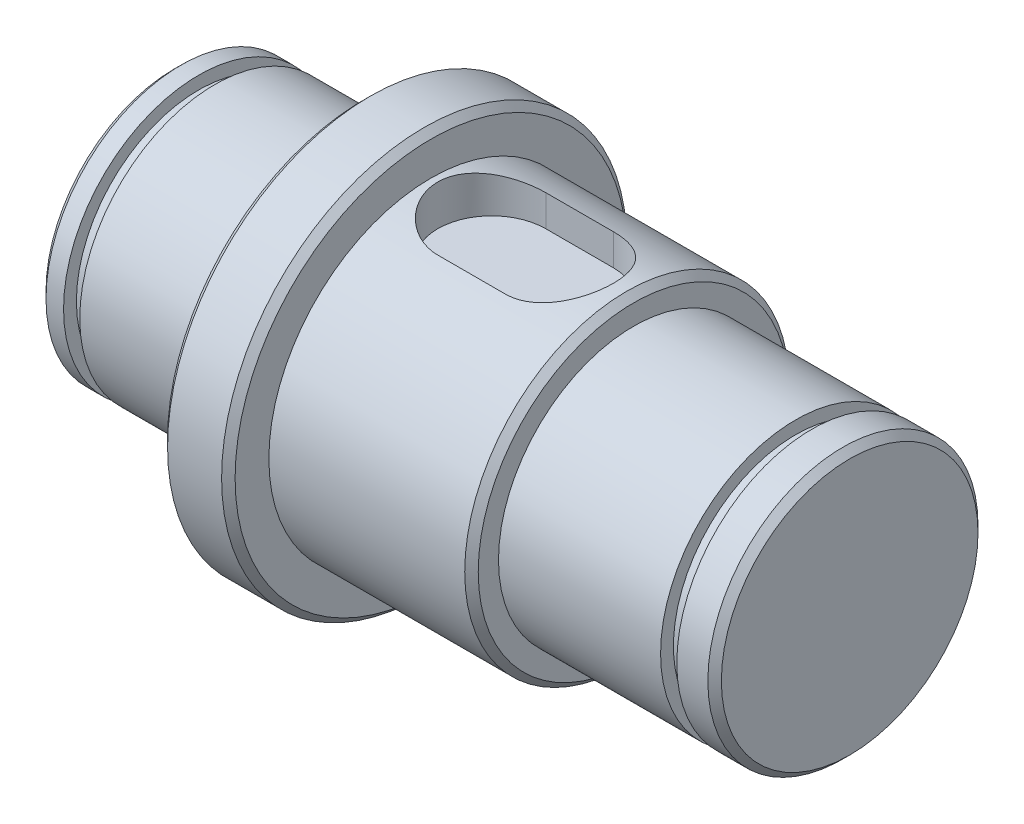
ISO-10303-21;
HEADER;
FILE_DESCRIPTION(('STEP AP214'),'2;1');
FILE_NAME('part.step','',(''),(''),'','','');
FILE_SCHEMA(('AUTOMOTIVE_DESIGN { 1 0 10303 214 1 1 1 1 }'));
ENDSEC;
DATA;
#1=APPLICATION_CONTEXT('core data for automotive mechanical design processes');
#2=APPLICATION_PROTOCOL_DEFINITION('international standard','automotive_design',2000,#1);
#3=PRODUCT_CONTEXT('',#1,'mechanical');
#4=PRODUCT('Part','Part','',(#3));
#5=PRODUCT_RELATED_PRODUCT_CATEGORY('part','',(#4));
#6=PRODUCT_DEFINITION_FORMATION('','',#4);
#7=PRODUCT_DEFINITION_CONTEXT('part definition',#1,'design');
#8=PRODUCT_DEFINITION('design','',#6,#7);
#9=PRODUCT_DEFINITION_SHAPE('','',#8);
#10=(LENGTH_UNIT() NAMED_UNIT(*) SI_UNIT(.MILLI.,.METRE.));
#11=(NAMED_UNIT(*) PLANE_ANGLE_UNIT() SI_UNIT($,.RADIAN.));
#12=(NAMED_UNIT(*) SI_UNIT($,.STERADIAN.) SOLID_ANGLE_UNIT());
#13=UNCERTAINTY_MEASURE_WITH_UNIT(LENGTH_MEASURE(1.E-05),#10,'distance_accuracy_value','');
#14=(GEOMETRIC_REPRESENTATION_CONTEXT(3) GLOBAL_UNCERTAINTY_ASSIGNED_CONTEXT((#13)) GLOBAL_UNIT_ASSIGNED_CONTEXT((#10,
#11,#12)) REPRESENTATION_CONTEXT('',''));
#15=CARTESIAN_POINT('',(0.,0.,0.));
#16=DIRECTION('',(0.,0.,1.));
#17=DIRECTION('',(1.,0.,0.));
#18=AXIS2_PLACEMENT_3D('',#15,#16,#17);
#19=CARTESIAN_POINT('',(-25.,0.,0.));
#20=DIRECTION('',(-1.,0.,0.));
#21=DIRECTION('',(0.,0.,1.));
#22=AXIS2_PLACEMENT_3D('',#19,#20,#21);
#23=CYLINDRICAL_SURFACE('',#22,10.);
#24=CARTESIAN_POINT('',(9.,0.,0.));
#25=DIRECTION('',(-1.,0.,0.));
#26=DIRECTION('',(0.,0.,1.));
#27=AXIS2_PLACEMENT_3D('',#24,#25,#26);
#28=CIRCLE('',#27,10.);
#29=CARTESIAN_POINT('',(9.,0.,10.));
#30=VERTEX_POINT('',#29);
#31=EDGE_CURVE('E127',#30,#30,#28,.T.);
#32=ORIENTED_EDGE('',*,*,#31,.F.);
#33=EDGE_LOOP('',(#32));
#34=FACE_BOUND('',#33,.T.);
#35=CARTESIAN_POINT('',(21.,0.,0.));
#36=DIRECTION('',(1.,0.,0.));
#37=DIRECTION('',(0.,0.,-1.));
#38=AXIS2_PLACEMENT_3D('',#35,#36,#37);
#39=CIRCLE('',#38,10.);
#40=CARTESIAN_POINT('',(21.,0.,-10.));
#41=VERTEX_POINT('',#40);
#42=EDGE_CURVE('E112',#41,#41,#39,.T.);
#43=ORIENTED_EDGE('',*,*,#42,.F.);
#44=EDGE_LOOP('',(#43));
#45=FACE_BOUND('',#44,.T.);
#46=ADVANCED_FACE('F35',(#34,#45),#23,.T.);
#47=CARTESIAN_POINT('',(-25.,0.,0.));
#48=DIRECTION('',(-1.,0.,0.));
#49=DIRECTION('',(0.,0.,1.));
#50=AXIS2_PLACEMENT_3D('',#47,#48,#49);
#51=CYLINDRICAL_SURFACE('',#50,10.);
#52=CARTESIAN_POINT('',(-11.,0.,0.));
#53=DIRECTION('',(-1.,0.,0.));
#54=DIRECTION('',(0.,0.,1.));
#55=AXIS2_PLACEMENT_3D('',#52,#53,#54);
#56=CIRCLE('',#55,10.);
#57=CARTESIAN_POINT('',(-11.,0.,10.));
#58=VERTEX_POINT('',#57);
#59=EDGE_CURVE('E135',#58,#58,#56,.T.);
#60=ORIENTED_EDGE('',*,*,#59,.T.);
#61=EDGE_LOOP('',(#60));
#62=FACE_BOUND('',#61,.T.);
#63=CARTESIAN_POINT('',(-22.,0.,0.));
#64=DIRECTION('',(-1.,0.,0.));
#65=DIRECTION('',(0.,0.,1.));
#66=AXIS2_PLACEMENT_3D('',#63,#64,#65);
#67=CIRCLE('',#66,10.);
#68=CARTESIAN_POINT('',(-22.,0.,10.));
#69=VERTEX_POINT('',#68);
#70=EDGE_CURVE('E124',#69,#69,#67,.T.);
#71=ORIENTED_EDGE('',*,*,#70,.F.);
#72=EDGE_LOOP('',(#71));
#73=FACE_BOUND('',#72,.T.);
#74=ADVANCED_FACE('F219',(#62,#73),#51,.T.);
#75=CARTESIAN_POINT('',(-11.,-10.,0.));
#76=DIRECTION('',(-1.,0.,0.));
#77=DIRECTION('',(0.,0.,1.));
#78=AXIS2_PLACEMENT_3D('',#75,#76,#77);
#79=PLANE('',#78);
#80=CARTESIAN_POINT('',(-11.,0.,0.));
#81=DIRECTION('',(-1.,0.,0.));
#82=DIRECTION('',(0.,0.,1.));
#83=AXIS2_PLACEMENT_3D('',#80,#81,#82);
#84=CIRCLE('',#83,14.5);
#85=CARTESIAN_POINT('',(-11.,0.,14.5));
#86=VERTEX_POINT('',#85);
#87=EDGE_CURVE('E159',#86,#86,#84,.T.);
#88=ORIENTED_EDGE('',*,*,#87,.T.);
#89=EDGE_LOOP('',(#88));
#90=FACE_BOUND('',#89,.T.);
#91=ORIENTED_EDGE('',*,*,#59,.F.);
#92=EDGE_LOOP('',(#91));
#93=FACE_BOUND('',#92,.T.);
#94=ADVANCED_FACE('F215',(#90,#93),#79,.T.);
#95=CARTESIAN_POINT('',(-25.,0.,0.));
#96=DIRECTION('',(-1.,0.,0.));
#97=DIRECTION('',(0.,0.,1.));
#98=AXIS2_PLACEMENT_3D('',#95,#96,#97);
#99=CYLINDRICAL_SURFACE('',#98,15.);
#100=CARTESIAN_POINT('',(-6.5,0.,0.));
#101=DIRECTION('',(1.,0.,0.));
#102=DIRECTION('',(0.,0.,-1.));
#103=AXIS2_PLACEMENT_3D('',#100,#101,#102);
#104=CIRCLE('',#103,15.);
#105=CARTESIAN_POINT('',(-6.5,0.,-15.));
#106=VERTEX_POINT('',#105);
#107=EDGE_CURVE('E153',#106,#106,#104,.F.);
#108=ORIENTED_EDGE('',*,*,#107,.T.);
#109=EDGE_LOOP('',(#108));
#110=FACE_BOUND('',#109,.T.);
#111=CARTESIAN_POINT('',(-10.5,0.,0.));
#112=DIRECTION('',(-1.,0.,0.));
#113=DIRECTION('',(0.,0.,1.));
#114=AXIS2_PLACEMENT_3D('',#111,#112,#113);
#115=CIRCLE('',#114,15.);
#116=CARTESIAN_POINT('',(-10.5,0.,15.));
#117=VERTEX_POINT('',#116);
#118=EDGE_CURVE('E150',#117,#117,#115,.F.);
#119=ORIENTED_EDGE('',*,*,#118,.T.);
#120=EDGE_LOOP('',(#119));
#121=FACE_BOUND('',#120,.T.);
#122=ADVANCED_FACE('F210',(#110,#121),#99,.T.);
#123=CARTESIAN_POINT('',(-6.,-15.,0.));
#124=DIRECTION('',(1.,0.,0.));
#125=DIRECTION('',(0.,0.,-1.));
#126=AXIS2_PLACEMENT_3D('',#123,#124,#125);
#127=PLANE('',#126);
#128=CARTESIAN_POINT('',(-6.,0.,0.));
#129=DIRECTION('',(1.,0.,0.));
#130=DIRECTION('',(0.,0.,-1.));
#131=AXIS2_PLACEMENT_3D('',#128,#129,#130);
#132=CIRCLE('',#131,14.5);
#133=CARTESIAN_POINT('',(-6.,0.,-14.5));
#134=VERTEX_POINT('',#133);
#135=EDGE_CURVE('E156',#134,#134,#132,.T.);
#136=ORIENTED_EDGE('',*,*,#135,.T.);
#137=EDGE_LOOP('',(#136));
#138=FACE_BOUND('',#137,.T.);
#139=CARTESIAN_POINT('',(-6.,0.,0.));
#140=DIRECTION('',(-1.,0.,0.));
#141=DIRECTION('',(0.,0.,1.));
#142=AXIS2_PLACEMENT_3D('',#139,#140,#141);
#143=CIRCLE('',#142,12.);
#144=CARTESIAN_POINT('',(-6.,0.,12.));
#145=VERTEX_POINT('',#144);
#146=EDGE_CURVE('E132',#145,#145,#143,.T.);
#147=ORIENTED_EDGE('',*,*,#146,.T.);
#148=EDGE_LOOP('',(#147));
#149=FACE_BOUND('',#148,.T.);
#150=ADVANCED_FACE('F204',(#138,#149),#127,.T.);
#151=CARTESIAN_POINT('',(-25.,0.,0.));
#152=DIRECTION('',(-1.,0.,0.));
#153=DIRECTION('',(0.,0.,1.));
#154=AXIS2_PLACEMENT_3D('',#151,#152,#153);
#155=CYLINDRICAL_SURFACE('',#154,12.);
#156=CARTESIAN_POINT('',(3.5,11.3137084989848,4.));
#157=CARTESIAN_POINT('',(3.60913132451254,11.3136910923705,4.0000143857665));
#158=CARTESIAN_POINT('',(3.71825291948064,11.3152871024731,3.99553419554536));
#159=CARTESIAN_POINT('',(3.9356496613588,11.3215763859361,3.97769673248752));
#160=CARTESIAN_POINT('',(4.04392502878086,11.3262688232103,3.96434185595522));
#161=CARTESIAN_POINT('',(4.25854478136731,11.3386032840401,3.92891935076474));
#162=CARTESIAN_POINT('',(4.3648939240815,11.3462365576019,3.90687756421021));
#163=CARTESIAN_POINT('',(4.57521322973239,11.364201918496,3.85430689648188));
#164=CARTESIAN_POINT('',(4.67918330654348,11.3745341033652,3.82377770857634));
#165=CARTESIAN_POINT('',(4.9863385275441,11.4091190527027,3.71986482089947));
#166=CARTESIAN_POINT('',(5.18508665195598,11.4369799021453,3.63410266896587));
#167=CARTESIAN_POINT('',(5.56540289833741,11.4991525453998,3.4322845456982));
#168=CARTESIAN_POINT('',(5.74696037723297,11.5334682968154,3.31620997228936));
#169=CARTESIAN_POINT('',(6.09486864556914,11.6061789182336,3.05220793355649));
#170=CARTESIAN_POINT('',(6.26045622848942,11.6446750308563,2.90330055412141));
#171=CARTESIAN_POINT('',(6.56482736511361,11.7205540276094,2.57995313902011));
#172=CARTESIAN_POINT('',(6.70360614588502,11.7579367125094,2.40550856651356));
#173=CARTESIAN_POINT('',(6.9539171590512,11.8285552975691,2.03041476001125));
#174=CARTESIAN_POINT('',(7.06464369326119,11.8616574966305,1.82920040495823));
#175=CARTESIAN_POINT('',(7.25036925102219,11.9187843500282,1.40971695235372));
#176=CARTESIAN_POINT('',(7.32537918861944,11.9428117769099,1.19145308844236));
#177=CARTESIAN_POINT('',(7.43494284516145,11.9783628445804,0.752117395358865));
#178=CARTESIAN_POINT('',(7.47081308509184,11.9902923605184,0.531407346429907));
#179=CARTESIAN_POINT('',(7.5052651992241,12.0017443351774,0.0867958692352795));
#180=CARTESIAN_POINT('',(7.50385595838735,12.0012697502156,-0.137104785886816));
#181=CARTESIAN_POINT('',(7.46462290474738,11.9882415502496,-0.572415361032319));
#182=CARTESIAN_POINT('',(7.42822959866962,11.9761624577266,-0.783970739663759));
#183=CARTESIAN_POINT('',(7.3224270547877,11.9418784019559,-1.19777632834894));
#184=CARTESIAN_POINT('',(7.25301598627315,11.9196728772387,-1.4000260217555));
#185=CARTESIAN_POINT('',(7.08231509392962,11.8670267992102,-1.79261022537109));
#186=CARTESIAN_POINT('',(6.98061796939386,11.8364817702071,-1.98275302130578));
#187=CARTESIAN_POINT('',(6.74855804396861,11.7703352504572,-2.34369935797279));
#188=CARTESIAN_POINT('',(6.61818744541234,11.7347323851811,-2.51449761883744));
#189=CARTESIAN_POINT('',(6.32532420781555,11.6602518814889,-2.84038544309998));
#190=CARTESIAN_POINT('',(6.16160988970107,11.6212989752184,-2.99435951335509));
#191=CARTESIAN_POINT('',(5.81020196665419,11.5458957896576,-3.27310303719343));
#192=CARTESIAN_POINT('',(5.62250064500035,11.5094463215614,-3.39786305574726));
#193=CARTESIAN_POINT('',(5.32528704962278,11.4595759659792,-3.56109757745215));
#194=CARTESIAN_POINT('',(5.22274459523252,11.4436484943195,-3.61182358389815));
#195=CARTESIAN_POINT('',(5.01343501904369,11.4140167075143,-3.70440095621127));
#196=CARTESIAN_POINT('',(4.9066696779244,11.4003114674865,-3.74625601636388));
#197=CARTESIAN_POINT('',(4.68978291343353,11.3755873303494,-3.82067426911565));
#198=CARTESIAN_POINT('',(4.57966528689594,11.3645655126344,-3.85324757051516));
#199=CARTESIAN_POINT('',(4.35683184555263,11.3455648512893,-3.90883841588792));
#200=CARTESIAN_POINT('',(4.24411724203817,11.3375846182867,-3.93186032329112));
#201=CARTESIAN_POINT('',(4.02635755344924,11.3254693235584,-3.96661962949784));
#202=CARTESIAN_POINT('',(3.92145048042139,11.3210705251979,-3.97913375141091));
#203=CARTESIAN_POINT('',(3.71103166730017,11.3151843303776,-3.99582494949883));
#204=CARTESIAN_POINT('',(3.60552088433212,11.3136931771535,-4.00001278362333));
#205=CARTESIAN_POINT('',(3.5,11.3137084989848,-4.));
#206=B_SPLINE_CURVE_WITH_KNOTS('',3,(#156,#157,#158,#159,#160,#161,#162,#163,#164,#165,#166,
#167,#168,#169,#170,#171,#172,#173,#174,#175,#176,#177,#178,#179,#180,#181,#182,#183,#184,#185,
#186,#187,#188,#189,#190,#191,#192,#193,#194,#195,#196,#197,#198,#199,#200,#201,#202,#203,#204,
#205),.UNSPECIFIED.,.F.,.F.,(4,2,2,2,2,2,2,2,2,2,2,2,2,2,2,2,2,2,2,2,2,2,2,2,4),(0.,
0.327273938941731,0.654459544677848,0.980679087086521,1.30691042048862,1.95841627077208,
2.61032287944837,3.28524582541423,3.96028882145702,4.65295094423118,5.34540127175222,
6.01376445600324,6.68196834813282,7.32396236553654,7.96599198323705,8.61646637994584,
9.26711789045787,9.94834778922914,10.6297973968768,10.9759539762202,11.3219661149517,
11.6675999574416,12.0130757272824,12.3299368411189,12.6463882889711),.UNSPECIFIED.);
#207=CARTESIAN_POINT('',(3.5,11.3137084989848,4.));
#208=VERTEX_POINT('',#207);
#209=CARTESIAN_POINT('',(3.5,11.3137084989848,-4.));
#210=VERTEX_POINT('',#209);
#211=EDGE_CURVE('E168',#208,#210,#206,.T.);
#212=ORIENTED_EDGE('',*,*,#211,.F.);
#213=DIRECTION('',(-1.,0.,0.));
#214=VECTOR('',#213,1.);
#215=CARTESIAN_POINT('',(-25.,11.3137084989848,4.));
#216=LINE('',#215,#214);
#217=CARTESIAN_POINT('',(-1.5,11.3137084989848,4.));
#218=VERTEX_POINT('',#217);
#219=EDGE_CURVE('E11',#218,#208,#216,.F.);
#220=ORIENTED_EDGE('',*,*,#219,.F.);
#221=CARTESIAN_POINT('',(-1.5,11.3137084989848,-4.));
#222=CARTESIAN_POINT('',(-1.60913132451253,11.3136910923705,-4.0000143857665));
#223=CARTESIAN_POINT('',(-1.71825291948063,11.3152871024731,-3.99553419554536));
#224=CARTESIAN_POINT('',(-1.9356496613588,11.3215763859361,-3.97769673248752));
#225=CARTESIAN_POINT('',(-2.04392502878085,11.3262688232103,-3.96434185595522));
#226=CARTESIAN_POINT('',(-2.2585447813673,11.3386032840401,-3.92891935076474));
#227=CARTESIAN_POINT('',(-2.36489392408149,11.3462365576019,-3.90687756421021));
#228=CARTESIAN_POINT('',(-2.57521322973238,11.364201918496,-3.85430689648188));
#229=CARTESIAN_POINT('',(-2.67918330654347,11.3745341033652,-3.82377770857634));
#230=CARTESIAN_POINT('',(-2.9863385275441,11.4091190527027,-3.71986482089947));
#231=CARTESIAN_POINT('',(-3.18508665195598,11.4369799021453,-3.63410266896587));
#232=CARTESIAN_POINT('',(-3.5654028983374,11.4991525453998,-3.4322845456982));
#233=CARTESIAN_POINT('',(-3.74696037723296,11.5334682968154,-3.31620997228937));
#234=CARTESIAN_POINT('',(-4.09486864556914,11.6061789182336,-3.05220793355649));
#235=CARTESIAN_POINT('',(-4.26045622848942,11.6446750308563,-2.90330055412141));
#236=CARTESIAN_POINT('',(-4.5648273651136,11.7205540276094,-2.57995313902011));
#237=CARTESIAN_POINT('',(-4.70360614588502,11.7579367125094,-2.40550856651356));
#238=CARTESIAN_POINT('',(-4.95391715905119,11.8285552975691,-2.03041476001125));
#239=CARTESIAN_POINT('',(-5.06464369326119,11.8616574966305,-1.82920040495823));
#240=CARTESIAN_POINT('',(-5.25036925102218,11.9187843500282,-1.40971695235373));
#241=CARTESIAN_POINT('',(-5.32537918861944,11.9428117769099,-1.19145308844236));
#242=CARTESIAN_POINT('',(-5.43494284516144,11.9783628445804,-0.752117395358866));
#243=CARTESIAN_POINT('',(-5.47081308509184,11.9902923605184,-0.531407346429907));
#244=CARTESIAN_POINT('',(-5.50526519922409,12.0017443351774,-0.08679586923528));
#245=CARTESIAN_POINT('',(-5.50385595838734,12.0012697502156,0.137104785886816));
#246=CARTESIAN_POINT('',(-5.46462290474737,11.9882415502496,0.572415361032319));
#247=CARTESIAN_POINT('',(-5.42822959866961,11.9761624577266,0.783970739663758));
#248=CARTESIAN_POINT('',(-5.3224270547877,11.9418784019559,1.19777632834894));
#249=CARTESIAN_POINT('',(-5.25301598627314,11.9196728772387,1.4000260217555));
#250=CARTESIAN_POINT('',(-5.08231509392962,11.8670267992102,1.79261022537109));
#251=CARTESIAN_POINT('',(-4.98061796939386,11.8364817702071,1.98275302130578));
#252=CARTESIAN_POINT('',(-4.7485580439686,11.7703352504572,2.34369935797278));
#253=CARTESIAN_POINT('',(-4.61818744541233,11.7347323851811,2.51449761883744));
#254=CARTESIAN_POINT('',(-4.32532420781555,11.6602518814889,2.84038544309998));
#255=CARTESIAN_POINT('',(-4.16160988970107,11.6212989752184,2.99435951335509));
#256=CARTESIAN_POINT('',(-3.81020196665418,11.5458957896576,3.27310303719343));
#257=CARTESIAN_POINT('',(-3.62250064500035,11.5094463215614,3.39786305574725));
#258=CARTESIAN_POINT('',(-3.32528704962278,11.4595759659792,3.56109757745215));
#259=CARTESIAN_POINT('',(-3.22274459523252,11.4436484943195,3.61182358389815));
#260=CARTESIAN_POINT('',(-3.01343501904369,11.4140167075143,3.70440095621127));
#261=CARTESIAN_POINT('',(-2.9066696779244,11.4003114674865,3.74625601636388));
#262=CARTESIAN_POINT('',(-2.68978291343353,11.3755873303494,3.82067426911565));
#263=CARTESIAN_POINT('',(-2.57966528689594,11.3645655126344,3.85324757051516));
#264=CARTESIAN_POINT('',(-2.35683184555263,11.3455648512893,3.90883841588792));
#265=CARTESIAN_POINT('',(-2.24411724203817,11.3375846182867,3.93186032329112));
#266=CARTESIAN_POINT('',(-2.02635755344924,11.3254693235584,3.96661962949784));
#267=CARTESIAN_POINT('',(-1.92145048042139,11.3210705251979,3.97913375141091));
#268=CARTESIAN_POINT('',(-1.71103166730016,11.3151843303776,3.99582494949883));
#269=CARTESIAN_POINT('',(-1.60552088433212,11.3136931771535,4.00001278362333));
#270=CARTESIAN_POINT('',(-1.5,11.3137084989848,4.));
#271=B_SPLINE_CURVE_WITH_KNOTS('',3,(#221,#222,#223,#224,#225,#226,#227,#228,#229,#230,#231,
#232,#233,#234,#235,#236,#237,#238,#239,#240,#241,#242,#243,#244,#245,#246,#247,#248,#249,#250,
#251,#252,#253,#254,#255,#256,#257,#258,#259,#260,#261,#262,#263,#264,#265,#266,#267,#268,#269,
#270),.UNSPECIFIED.,.F.,.F.,(4,2,2,2,2,2,2,2,2,2,2,2,2,2,2,2,2,2,2,2,2,2,2,2,4),(0.,
0.32727393894173,0.654459544677847,0.980679087086519,1.30691042048862,1.95841627077208,
2.61032287944837,3.28524582541423,3.96028882145702,4.65295094423118,5.34540127175222,
6.01376445600324,6.68196834813282,7.32396236553654,7.96599198323704,8.61646637994584,
9.26711789045787,9.94834778922914,10.6297973968768,10.9759539762202,11.3219661149517,
11.6675999574416,12.0130757272824,12.3299368411189,12.6463882889711),.UNSPECIFIED.);
#272=CARTESIAN_POINT('',(-1.5,11.3137084989848,-4.));
#273=VERTEX_POINT('',#272);
#274=EDGE_CURVE('E44',#273,#218,#271,.T.);
#275=ORIENTED_EDGE('',*,*,#274,.F.);
#276=DIRECTION('',(-1.,0.,0.));
#277=VECTOR('',#276,1.);
#278=CARTESIAN_POINT('',(-25.,11.3137084989848,-4.));
#279=LINE('',#278,#277);
#280=EDGE_CURVE('E176',#210,#273,#279,.T.);
#281=ORIENTED_EDGE('',*,*,#280,.F.);
#282=EDGE_LOOP('',(#212,#220,#275,#281));
#283=FACE_BOUND('',#282,.T.);
#284=CARTESIAN_POINT('',(8.49999999999999,0.,0.));
#285=DIRECTION('',(1.,0.,0.));
#286=DIRECTION('',(0.,0.,-1.));
#287=AXIS2_PLACEMENT_3D('',#284,#285,#286);
#288=CIRCLE('',#287,12.);
#289=CARTESIAN_POINT('',(8.49999999999999,0.,-12.));
#290=VERTEX_POINT('',#289);
#291=EDGE_CURVE('E144',#290,#290,#288,.F.);
#292=ORIENTED_EDGE('',*,*,#291,.T.);
#293=EDGE_LOOP('',(#292));
#294=FACE_BOUND('',#293,.T.);
#295=ORIENTED_EDGE('',*,*,#146,.F.);
#296=EDGE_LOOP('',(#295));
#297=FACE_BOUND('',#296,.T.);
#298=ADVANCED_FACE('F177',(#283,#294,#297),#155,.T.);
#299=CARTESIAN_POINT('',(9.,-12.,0.));
#300=DIRECTION('',(1.,0.,0.));
#301=DIRECTION('',(0.,0.,-1.));
#302=AXIS2_PLACEMENT_3D('',#299,#300,#301);
#303=PLANE('',#302);
#304=CARTESIAN_POINT('',(9.,0.,0.));
#305=DIRECTION('',(1.,0.,0.));
#306=DIRECTION('',(0.,0.,-1.));
#307=AXIS2_PLACEMENT_3D('',#304,#305,#306);
#308=CIRCLE('',#307,11.5);
#309=CARTESIAN_POINT('',(9.,0.,-11.5));
#310=VERTEX_POINT('',#309);
#311=EDGE_CURVE('E147',#310,#310,#308,.T.);
#312=ORIENTED_EDGE('',*,*,#311,.T.);
#313=EDGE_LOOP('',(#312));
#314=FACE_BOUND('',#313,.T.);
#315=ORIENTED_EDGE('',*,*,#31,.T.);
#316=EDGE_LOOP('',(#315));
#317=FACE_BOUND('',#316,.T.);
#318=ADVANCED_FACE('F203',(#314,#317),#303,.T.);
#319=CARTESIAN_POINT('',(-22.,0.,0.));
#320=DIRECTION('',(-1.,0.,0.));
#321=DIRECTION('',(0.,0.,1.));
#322=AXIS2_PLACEMENT_3D('',#319,#320,#321);
#323=PLANE('',#322);
#324=CARTESIAN_POINT('',(-22.,0.,0.));
#325=DIRECTION('',(-1.,0.,0.));
#326=DIRECTION('',(0.,0.,1.));
#327=AXIS2_PLACEMENT_3D('',#324,#325,#326);
#328=CIRCLE('',#327,9.05);
#329=CARTESIAN_POINT('',(-22.,0.,9.05));
#330=VERTEX_POINT('',#329);
#331=EDGE_CURVE('E118',#330,#330,#328,.T.);
#332=ORIENTED_EDGE('',*,*,#331,.F.);
#333=EDGE_LOOP('',(#332));
#334=FACE_BOUND('',#333,.T.);
#335=ORIENTED_EDGE('',*,*,#70,.T.);
#336=EDGE_LOOP('',(#335));
#337=FACE_BOUND('',#336,.T.);
#338=ADVANCED_FACE('F266',(#334,#337),#323,.T.);
#339=CARTESIAN_POINT('',(-23.2,0.,0.));
#340=DIRECTION('',(-1.,0.,0.));
#341=DIRECTION('',(0.,0.,1.));
#342=AXIS2_PLACEMENT_3D('',#339,#340,#341);
#343=PLANE('',#342);
#344=CARTESIAN_POINT('',(-23.2,0.,0.));
#345=DIRECTION('',(-1.,0.,0.));
#346=DIRECTION('',(0.,0.,1.));
#347=AXIS2_PLACEMENT_3D('',#344,#345,#346);
#348=CIRCLE('',#347,9.05);
#349=CARTESIAN_POINT('',(-23.2,0.,9.05));
#350=VERTEX_POINT('',#349);
#351=EDGE_CURVE('E115',#350,#350,#348,.T.);
#352=ORIENTED_EDGE('',*,*,#351,.T.);
#353=EDGE_LOOP('',(#352));
#354=FACE_BOUND('',#353,.T.);
#355=CARTESIAN_POINT('',(-23.2,0.,0.));
#356=DIRECTION('',(-1.,0.,0.));
#357=DIRECTION('',(0.,0.,1.));
#358=AXIS2_PLACEMENT_3D('',#355,#356,#357);
#359=CIRCLE('',#358,10.);
#360=CARTESIAN_POINT('',(-23.2,0.,10.));
#361=VERTEX_POINT('',#360);
#362=EDGE_CURVE('E121',#361,#361,#359,.T.);
#363=ORIENTED_EDGE('',*,*,#362,.F.);
#364=EDGE_LOOP('',(#363));
#365=FACE_BOUND('',#364,.T.);
#366=ADVANCED_FACE('F264',(#354,#365),#343,.F.);
#367=CARTESIAN_POINT('',(-22.,0.,0.));
#368=DIRECTION('',(-1.,0.,0.));
#369=DIRECTION('',(0.,0.,1.));
#370=AXIS2_PLACEMENT_3D('',#367,#368,#369);
#371=CYLINDRICAL_SURFACE('',#370,9.05);
#372=ORIENTED_EDGE('',*,*,#331,.T.);
#373=EDGE_LOOP('',(#372));
#374=FACE_BOUND('',#373,.T.);
#375=ORIENTED_EDGE('',*,*,#351,.F.);
#376=EDGE_LOOP('',(#375));
#377=FACE_BOUND('',#376,.T.);
#378=ADVANCED_FACE('F260',(#374,#377),#371,.T.);
#379=CARTESIAN_POINT('',(-25.,0.,0.));
#380=DIRECTION('',(-1.,0.,0.));
#381=DIRECTION('',(0.,0.,1.));
#382=AXIS2_PLACEMENT_3D('',#379,#380,#381);
#383=PLANE('',#382);
#384=CARTESIAN_POINT('',(-25.,0.,0.));
#385=DIRECTION('',(-1.,0.,0.));
#386=DIRECTION('',(0.,0.,1.));
#387=AXIS2_PLACEMENT_3D('',#384,#385,#386);
#388=CIRCLE('',#387,9.50000000000002);
#389=CARTESIAN_POINT('',(-25.,0.,9.50000000000002));
#390=VERTEX_POINT('',#389);
#391=EDGE_CURVE('E162',#390,#390,#388,.T.);
#392=ORIENTED_EDGE('',*,*,#391,.T.);
#393=EDGE_LOOP('',(#392));
#394=FACE_BOUND('',#393,.T.);
#395=ADVANCED_FACE('F263',(#394),#383,.T.);
#396=CARTESIAN_POINT('',(-24.5,0.,0.));
#397=DIRECTION('',(-1.,0.,0.));
#398=DIRECTION('',(0.,0.,1.));
#399=AXIS2_PLACEMENT_3D('',#396,#397,#398);
#400=CIRCLE('',#399,10.);
#401=CARTESIAN_POINT('',(-24.5,0.,10.));
#402=VERTEX_POINT('',#401);
#403=EDGE_CURVE('E165',#402,#402,#400,.F.);
#404=ORIENTED_EDGE('',*,*,#403,.T.);
#405=EDGE_LOOP('',(#404));
#406=FACE_BOUND('',#405,.T.);
#407=ORIENTED_EDGE('',*,*,#362,.T.);
#408=EDGE_LOOP('',(#407));
#409=FACE_BOUND('',#408,.T.);
#410=ADVANCED_FACE('F228',(#406,#409),#51,.T.);
#411=CARTESIAN_POINT('',(21.,0.,0.));
#412=DIRECTION('',(1.,0.,0.));
#413=DIRECTION('',(0.,0.,-1.));
#414=AXIS2_PLACEMENT_3D('',#411,#412,#413);
#415=PLANE('',#414);
#416=CARTESIAN_POINT('',(21.,0.,0.));
#417=DIRECTION('',(1.,0.,0.));
#418=DIRECTION('',(0.,0.,-1.));
#419=AXIS2_PLACEMENT_3D('',#416,#417,#418);
#420=CIRCLE('',#419,9.05);
#421=CARTESIAN_POINT('',(21.,0.,-9.05));
#422=VERTEX_POINT('',#421);
#423=EDGE_CURVE('E106',#422,#422,#420,.T.);
#424=ORIENTED_EDGE('',*,*,#423,.F.);
#425=EDGE_LOOP('',(#424));
#426=FACE_BOUND('',#425,.T.);
#427=ORIENTED_EDGE('',*,*,#42,.T.);
#428=EDGE_LOOP('',(#427));
#429=FACE_BOUND('',#428,.T.);
#430=ADVANCED_FACE('F250',(#426,#429),#415,.T.);
#431=CARTESIAN_POINT('',(22.2,0.,0.));
#432=DIRECTION('',(1.,0.,0.));
#433=DIRECTION('',(0.,0.,-1.));
#434=AXIS2_PLACEMENT_3D('',#431,#432,#433);
#435=PLANE('',#434);
#436=CARTESIAN_POINT('',(22.2,0.,0.));
#437=DIRECTION('',(1.,0.,0.));
#438=DIRECTION('',(0.,0.,-1.));
#439=AXIS2_PLACEMENT_3D('',#436,#437,#438);
#440=CIRCLE('',#439,9.05);
#441=CARTESIAN_POINT('',(22.2,0.,-9.05));
#442=VERTEX_POINT('',#441);
#443=EDGE_CURVE('E101',#442,#442,#440,.T.);
#444=ORIENTED_EDGE('',*,*,#443,.T.);
#445=EDGE_LOOP('',(#444));
#446=FACE_BOUND('',#445,.T.);
#447=CARTESIAN_POINT('',(22.2,0.,0.));
#448=DIRECTION('',(1.,0.,0.));
#449=DIRECTION('',(0.,0.,-1.));
#450=AXIS2_PLACEMENT_3D('',#447,#448,#449);
#451=CIRCLE('',#450,10.);
#452=CARTESIAN_POINT('',(22.2,0.,-10.));
#453=VERTEX_POINT('',#452);
#454=EDGE_CURVE('E109',#453,#453,#451,.T.);
#455=ORIENTED_EDGE('',*,*,#454,.F.);
#456=EDGE_LOOP('',(#455));
#457=FACE_BOUND('',#456,.T.);
#458=ADVANCED_FACE('F248',(#446,#457),#435,.F.);
#459=CARTESIAN_POINT('',(21.,0.,0.));
#460=DIRECTION('',(1.,0.,0.));
#461=DIRECTION('',(0.,0.,-1.));
#462=AXIS2_PLACEMENT_3D('',#459,#460,#461);
#463=CYLINDRICAL_SURFACE('',#462,9.05);
#464=ORIENTED_EDGE('',*,*,#423,.T.);
#465=EDGE_LOOP('',(#464));
#466=FACE_BOUND('',#465,.T.);
#467=ORIENTED_EDGE('',*,*,#443,.F.);
#468=EDGE_LOOP('',(#467));
#469=FACE_BOUND('',#468,.T.);
#470=ADVANCED_FACE('F194',(#466,#469),#463,.T.);
#471=CARTESIAN_POINT('',(25.,-10.,0.));
#472=DIRECTION('',(1.,0.,0.));
#473=DIRECTION('',(0.,0.,-1.));
#474=AXIS2_PLACEMENT_3D('',#471,#472,#473);
#475=PLANE('',#474);
#476=CARTESIAN_POINT('',(25.,0.,0.));
#477=DIRECTION('',(1.,0.,0.));
#478=DIRECTION('',(0.,0.,-1.));
#479=AXIS2_PLACEMENT_3D('',#476,#477,#478);
#480=CIRCLE('',#479,9.49999999999999);
#481=CARTESIAN_POINT('',(25.,0.,-9.49999999999999));
#482=VERTEX_POINT('',#481);
#483=EDGE_CURVE('E141',#482,#482,#480,.T.);
#484=ORIENTED_EDGE('',*,*,#483,.T.);
#485=EDGE_LOOP('',(#484));
#486=FACE_BOUND('',#485,.T.);
#487=ADVANCED_FACE('F234',(#486),#475,.T.);
#488=CARTESIAN_POINT('',(24.5,0.,0.));
#489=DIRECTION('',(1.,0.,0.));
#490=DIRECTION('',(0.,0.,-1.));
#491=AXIS2_PLACEMENT_3D('',#488,#489,#490);
#492=CIRCLE('',#491,10.);
#493=CARTESIAN_POINT('',(24.5,0.,-10.));
#494=VERTEX_POINT('',#493);
#495=EDGE_CURVE('E138',#494,#494,#492,.F.);
#496=ORIENTED_EDGE('',*,*,#495,.T.);
#497=EDGE_LOOP('',(#496));
#498=FACE_BOUND('',#497,.T.);
#499=ORIENTED_EDGE('',*,*,#454,.T.);
#500=EDGE_LOOP('',(#499));
#501=FACE_BOUND('',#500,.T.);
#502=ADVANCED_FACE('F222',(#498,#501),#23,.T.);
#503=CARTESIAN_POINT('',(24.5,0.,0.));
#504=DIRECTION('',(-1.,0.,0.));
#505=DIRECTION('',(0.,0.,1.));
#506=AXIS2_PLACEMENT_3D('',#503,#504,#505);
#507=CONICAL_SURFACE('',#506,10.,0.785398163397448);
#508=ORIENTED_EDGE('',*,*,#483,.F.);
#509=EDGE_LOOP('',(#508));
#510=FACE_BOUND('',#509,.T.);
#511=ORIENTED_EDGE('',*,*,#495,.F.);
#512=EDGE_LOOP('',(#511));
#513=FACE_BOUND('',#512,.T.);
#514=ADVANCED_FACE('F233',(#510,#513),#507,.T.);
#515=CARTESIAN_POINT('',(8.49999999999999,0.,0.));
#516=DIRECTION('',(-1.,0.,0.));
#517=DIRECTION('',(0.,0.,1.));
#518=AXIS2_PLACEMENT_3D('',#515,#516,#517);
#519=CONICAL_SURFACE('',#518,12.,0.785398163397448);
#520=ORIENTED_EDGE('',*,*,#311,.F.);
#521=EDGE_LOOP('',(#520));
#522=FACE_BOUND('',#521,.T.);
#523=ORIENTED_EDGE('',*,*,#291,.F.);
#524=EDGE_LOOP('',(#523));
#525=FACE_BOUND('',#524,.T.);
#526=ADVANCED_FACE('F240',(#522,#525),#519,.T.);
#527=CARTESIAN_POINT('',(-6.5,0.,0.));
#528=DIRECTION('',(-1.,0.,0.));
#529=DIRECTION('',(0.,0.,1.));
#530=AXIS2_PLACEMENT_3D('',#527,#528,#529);
#531=CONICAL_SURFACE('',#530,15.,0.785398163397452);
#532=ORIENTED_EDGE('',*,*,#135,.F.);
#533=EDGE_LOOP('',(#532));
#534=FACE_BOUND('',#533,.T.);
#535=ORIENTED_EDGE('',*,*,#107,.F.);
#536=EDGE_LOOP('',(#535));
#537=FACE_BOUND('',#536,.T.);
#538=ADVANCED_FACE('F296',(#534,#537),#531,.T.);
#539=CARTESIAN_POINT('',(-11.,0.,0.));
#540=DIRECTION('',(1.,0.,0.));
#541=DIRECTION('',(0.,0.,-1.));
#542=AXIS2_PLACEMENT_3D('',#539,#540,#541);
#543=CONICAL_SURFACE('',#542,14.5,0.785398163397443);
#544=ORIENTED_EDGE('',*,*,#118,.F.);
#545=EDGE_LOOP('',(#544));
#546=FACE_BOUND('',#545,.T.);
#547=ORIENTED_EDGE('',*,*,#87,.F.);
#548=EDGE_LOOP('',(#547));
#549=FACE_BOUND('',#548,.T.);
#550=ADVANCED_FACE('F302',(#546,#549),#543,.T.);
#551=CARTESIAN_POINT('',(-25.,0.,0.));
#552=DIRECTION('',(1.,0.,0.));
#553=DIRECTION('',(0.,0.,-1.));
#554=AXIS2_PLACEMENT_3D('',#551,#552,#553);
#555=CONICAL_SURFACE('',#554,9.50000000000002,0.785398163397441);
#556=ORIENTED_EDGE('',*,*,#403,.F.);
#557=EDGE_LOOP('',(#556));
#558=FACE_BOUND('',#557,.T.);
#559=ORIENTED_EDGE('',*,*,#391,.F.);
#560=EDGE_LOOP('',(#559));
#561=FACE_BOUND('',#560,.T.);
#562=ADVANCED_FACE('F38',(#558,#561),#555,.T.);
#563=CARTESIAN_POINT('',(-1.5,9.00000000000001,0.));
#564=DIRECTION('',(0.,1.,0.));
#565=DIRECTION('',(0.,0.,1.));
#566=AXIS2_PLACEMENT_3D('',#563,#564,#565);
#567=CYLINDRICAL_SURFACE('',#566,4.);
#568=DIRECTION('',(0.,1.,0.));
#569=VECTOR('',#568,1.);
#570=CARTESIAN_POINT('',(-1.5,9.00000000000001,-4.));
#571=LINE('',#570,#569);
#572=CARTESIAN_POINT('',(-1.5,9.00000000000001,-4.));
#573=VERTEX_POINT('',#572);
#574=EDGE_CURVE('E99',#573,#273,#571,.T.);
#575=ORIENTED_EDGE('',*,*,#574,.T.);
#576=ORIENTED_EDGE('',*,*,#274,.T.);
#577=DIRECTION('',(0.,1.,0.));
#578=VECTOR('',#577,1.);
#579=CARTESIAN_POINT('',(-1.5,9.00000000000001,4.));
#580=LINE('',#579,#578);
#581=CARTESIAN_POINT('',(-1.5,9.00000000000001,4.));
#582=VERTEX_POINT('',#581);
#583=EDGE_CURVE('E50',#582,#218,#580,.T.);
#584=ORIENTED_EDGE('',*,*,#583,.F.);
#585=CARTESIAN_POINT('',(-1.5,9.00000000000001,0.));
#586=DIRECTION('',(0.,1.,0.));
#587=DIRECTION('',(0.,0.,1.));
#588=AXIS2_PLACEMENT_3D('',#585,#586,#587);
#589=CIRCLE('',#588,4.);
#590=EDGE_CURVE('E79',#573,#582,#589,.T.);
#591=ORIENTED_EDGE('',*,*,#590,.F.);
#592=EDGE_LOOP('',(#575,#576,#584,#591));
#593=FACE_BOUND('',#592,.T.);
#594=ADVANCED_FACE('F77',(#593),#567,.F.);
#595=CARTESIAN_POINT('',(-1.5,9.00000000000001,-4.));
#596=DIRECTION('',(0.,0.,-1.));
#597=DIRECTION('',(-1.,0.,0.));
#598=AXIS2_PLACEMENT_3D('',#595,#596,#597);
#599=PLANE('',#598);
#600=ORIENTED_EDGE('',*,*,#280,.T.);
#601=ORIENTED_EDGE('',*,*,#574,.F.);
#602=DIRECTION('',(-1.,0.,0.));
#603=VECTOR('',#602,1.);
#604=CARTESIAN_POINT('',(-1.5,9.00000000000001,-4.));
#605=LINE('',#604,#603);
#606=CARTESIAN_POINT('',(3.5,9.00000000000001,-4.));
#607=VERTEX_POINT('',#606);
#608=EDGE_CURVE('E82',#607,#573,#605,.T.);
#609=ORIENTED_EDGE('',*,*,#608,.F.);
#610=DIRECTION('',(0.,1.,0.));
#611=VECTOR('',#610,1.);
#612=CARTESIAN_POINT('',(3.5,9.00000000000001,-4.));
#613=LINE('',#612,#611);
#614=EDGE_CURVE('E102',#607,#210,#613,.T.);
#615=ORIENTED_EDGE('',*,*,#614,.T.);
#616=EDGE_LOOP('',(#600,#601,#609,#615));
#617=FACE_BOUND('',#616,.T.);
#618=ADVANCED_FACE('F186',(#617),#599,.F.);
#619=CARTESIAN_POINT('',(3.5,9.00000000000001,0.));
#620=DIRECTION('',(0.,1.,0.));
#621=DIRECTION('',(0.,0.,1.));
#622=AXIS2_PLACEMENT_3D('',#619,#620,#621);
#623=CYLINDRICAL_SURFACE('',#622,4.);
#624=DIRECTION('',(0.,1.,0.));
#625=VECTOR('',#624,1.);
#626=CARTESIAN_POINT('',(3.5,9.00000000000001,4.));
#627=LINE('',#626,#625);
#628=CARTESIAN_POINT('',(3.5,9.00000000000001,4.));
#629=VERTEX_POINT('',#628);
#630=EDGE_CURVE('E81',#629,#208,#627,.T.);
#631=ORIENTED_EDGE('',*,*,#630,.T.);
#632=ORIENTED_EDGE('',*,*,#211,.T.);
#633=ORIENTED_EDGE('',*,*,#614,.F.);
#634=CARTESIAN_POINT('',(3.5,9.00000000000001,0.));
#635=DIRECTION('',(0.,1.,0.));
#636=DIRECTION('',(0.,0.,1.));
#637=AXIS2_PLACEMENT_3D('',#634,#635,#636);
#638=CIRCLE('',#637,4.);
#639=EDGE_CURVE('E91',#629,#607,#638,.T.);
#640=ORIENTED_EDGE('',*,*,#639,.F.);
#641=EDGE_LOOP('',(#631,#632,#633,#640));
#642=FACE_BOUND('',#641,.T.);
#643=ADVANCED_FACE('F181',(#642),#623,.F.);
#644=CARTESIAN_POINT('',(-1.5,9.00000000000001,4.));
#645=DIRECTION('',(0.,0.,1.));
#646=DIRECTION('',(1.,0.,0.));
#647=AXIS2_PLACEMENT_3D('',#644,#645,#646);
#648=PLANE('',#647);
#649=ORIENTED_EDGE('',*,*,#219,.T.);
#650=ORIENTED_EDGE('',*,*,#630,.F.);
#651=DIRECTION('',(1.,0.,0.));
#652=VECTOR('',#651,1.);
#653=CARTESIAN_POINT('',(-1.5,9.00000000000001,4.));
#654=LINE('',#653,#652);
#655=EDGE_CURVE('E85',#582,#629,#654,.T.);
#656=ORIENTED_EDGE('',*,*,#655,.F.);
#657=ORIENTED_EDGE('',*,*,#583,.T.);
#658=EDGE_LOOP('',(#649,#650,#656,#657));
#659=FACE_BOUND('',#658,.T.);
#660=ADVANCED_FACE('F86',(#659),#648,.F.);
#661=CARTESIAN_POINT('',(-1.5,9.00000000000001,0.));
#662=DIRECTION('',(0.,1.,0.));
#663=DIRECTION('',(0.,0.,1.));
#664=AXIS2_PLACEMENT_3D('',#661,#662,#663);
#665=PLANE('',#664);
#666=ORIENTED_EDGE('',*,*,#590,.T.);
#667=ORIENTED_EDGE('',*,*,#655,.T.);
#668=ORIENTED_EDGE('',*,*,#639,.T.);
#669=ORIENTED_EDGE('',*,*,#608,.T.);
#670=EDGE_LOOP('',(#666,#667,#668,#669));
#671=FACE_BOUND('',#670,.T.);
#672=ADVANCED_FACE('F93',(#671),#665,.T.);
#673=CLOSED_SHELL('',(#46,#74,#94,#122,#150,#298,#318,#338,#366,#378,#395,#410,#430,#458,#470,
#487,#502,#514,#526,#538,#550,#562,#594,#618,#643,#660,#672));
#674=MANIFOLD_SOLID_BREP('B2',#673);
#675=ADVANCED_BREP_SHAPE_REPRESENTATION('',(#18,#674),#14);
#676=SHAPE_DEFINITION_REPRESENTATION(#9,#675);
ENDSEC;
END-ISO-10303-21;
